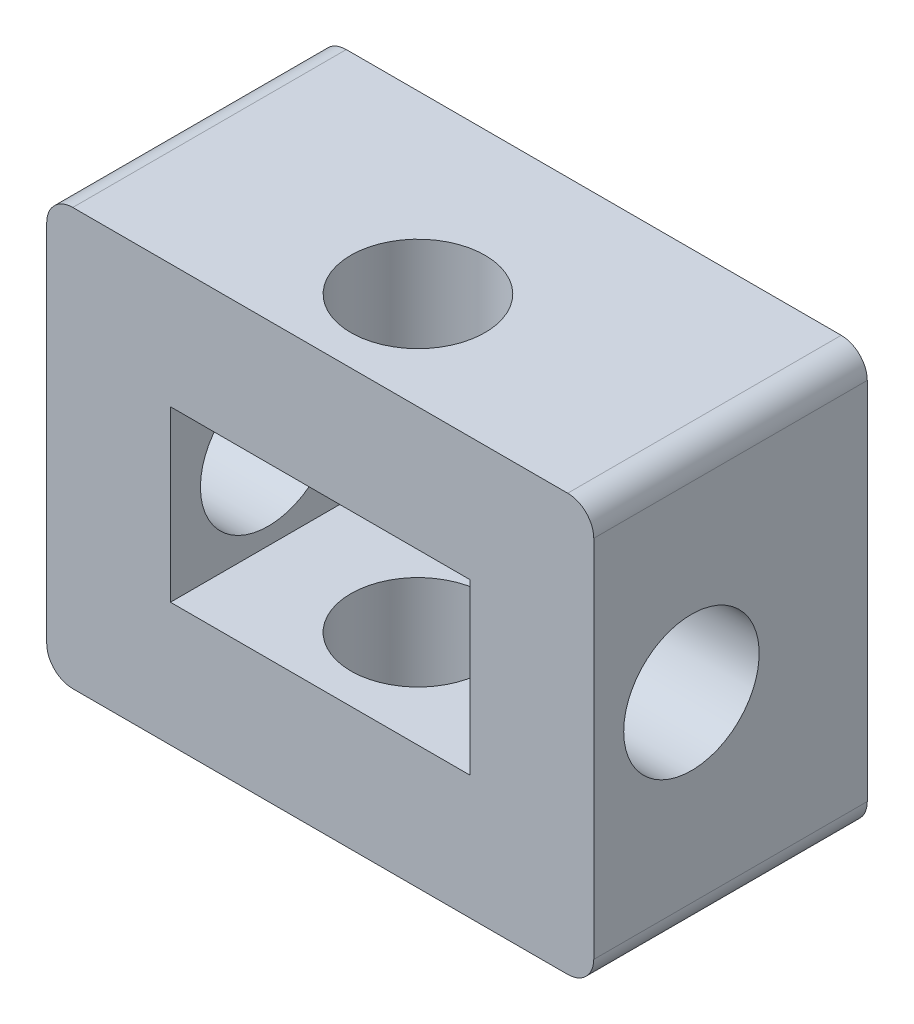
ISO-10303-21;
HEADER;
FILE_DESCRIPTION(('STEP AP214'),'2;1');
FILE_NAME('part.step','',(''),(''),'','','');
FILE_SCHEMA(('AUTOMOTIVE_DESIGN { 1 0 10303 214 1 1 1 1 }'));
ENDSEC;
DATA;
#1=APPLICATION_CONTEXT('core data for automotive mechanical design processes');
#2=APPLICATION_PROTOCOL_DEFINITION('international standard','automotive_design',2000,#1);
#3=PRODUCT_CONTEXT('',#1,'mechanical');
#4=PRODUCT('Part','Part','',(#3));
#5=PRODUCT_RELATED_PRODUCT_CATEGORY('part','',(#4));
#6=PRODUCT_DEFINITION_FORMATION('','',#4);
#7=PRODUCT_DEFINITION_CONTEXT('part definition',#1,'design');
#8=PRODUCT_DEFINITION('design','',#6,#7);
#9=PRODUCT_DEFINITION_SHAPE('','',#8);
#10=(LENGTH_UNIT() NAMED_UNIT(*) SI_UNIT(.MILLI.,.METRE.));
#11=(NAMED_UNIT(*) PLANE_ANGLE_UNIT() SI_UNIT($,.RADIAN.));
#12=(NAMED_UNIT(*) SI_UNIT($,.STERADIAN.) SOLID_ANGLE_UNIT());
#13=UNCERTAINTY_MEASURE_WITH_UNIT(LENGTH_MEASURE(1.E-05),#10,'distance_accuracy_value','');
#14=(GEOMETRIC_REPRESENTATION_CONTEXT(3) GLOBAL_UNCERTAINTY_ASSIGNED_CONTEXT((#13)) GLOBAL_UNIT_ASSIGNED_CONTEXT((#10,
#11,#12)) REPRESENTATION_CONTEXT('',''));
#15=CARTESIAN_POINT('',(0.,0.,0.));
#16=DIRECTION('',(0.,0.,1.));
#17=DIRECTION('',(1.,0.,0.));
#18=AXIS2_PLACEMENT_3D('',#15,#16,#17);
#19=CARTESIAN_POINT('',(-21.,-16.,21.));
#20=DIRECTION('',(1.,0.,0.));
#21=DIRECTION('',(0.,0.,-1.));
#22=AXIS2_PLACEMENT_3D('',#19,#20,#21);
#23=PLANE('',#22);
#24=CARTESIAN_POINT('',(-21.,0.,13.5));
#25=DIRECTION('',(-1.,0.,0.));
#26=DIRECTION('',(0.,0.,1.));
#27=AXIS2_PLACEMENT_3D('',#24,#25,#26);
#28=CIRCLE('',#27,5.2);
#29=CARTESIAN_POINT('',(-21.,0.,18.7));
#30=VERTEX_POINT('',#29);
#31=EDGE_CURVE('E533',#30,#30,#28,.T.);
#32=ORIENTED_EDGE('',*,*,#31,.F.);
#33=EDGE_LOOP('',(#32));
#34=FACE_BOUND('',#33,.T.);
#35=DIRECTION('',(0.,-1.,0.));
#36=VECTOR('',#35,1.);
#37=CARTESIAN_POINT('',(-21.,-16.,0.));
#38=LINE('',#37,#36);
#39=CARTESIAN_POINT('',(-21.,14.,0.));
#40=VERTEX_POINT('',#39);
#41=CARTESIAN_POINT('',(-21.,-14.,0.));
#42=VERTEX_POINT('',#41);
#43=EDGE_CURVE('E186',#40,#42,#38,.T.);
#44=ORIENTED_EDGE('',*,*,#43,.T.);
#45=DIRECTION('',(0.,0.,-1.));
#46=VECTOR('',#45,1.);
#47=CARTESIAN_POINT('',(-21.,-14.,21.));
#48=LINE('',#47,#46);
#49=CARTESIAN_POINT('',(-21.,-14.,21.));
#50=VERTEX_POINT('',#49);
#51=EDGE_CURVE('E273',#42,#50,#48,.F.);
#52=ORIENTED_EDGE('',*,*,#51,.T.);
#53=DIRECTION('',(0.,-1.,0.));
#54=VECTOR('',#53,1.);
#55=CARTESIAN_POINT('',(-21.,-16.,21.));
#56=LINE('',#55,#54);
#57=CARTESIAN_POINT('',(-21.,14.,21.));
#58=VERTEX_POINT('',#57);
#59=EDGE_CURVE('E192',#58,#50,#56,.T.);
#60=ORIENTED_EDGE('',*,*,#59,.F.);
#61=DIRECTION('',(0.,0.,-1.));
#62=VECTOR('',#61,1.);
#63=CARTESIAN_POINT('',(-21.,14.,21.));
#64=LINE('',#63,#62);
#65=EDGE_CURVE('E269',#58,#40,#64,.T.);
#66=ORIENTED_EDGE('',*,*,#65,.T.);
#67=EDGE_LOOP('',(#44,#52,#60,#66));
#68=FACE_BOUND('',#67,.T.);
#69=ADVANCED_FACE('F43',(#34,#68),#23,.F.);
#70=CARTESIAN_POINT('',(21.,-16.,21.));
#71=DIRECTION('',(0.,1.,0.));
#72=DIRECTION('',(-1.,0.,0.));
#73=AXIS2_PLACEMENT_3D('',#70,#71,#72);
#74=PLANE('',#73);
#75=CARTESIAN_POINT('',(0.,-16.,13.5));
#76=DIRECTION('',(0.,1.,0.));
#77=DIRECTION('',(-1.,0.,0.));
#78=AXIS2_PLACEMENT_3D('',#75,#76,#77);
#79=CIRCLE('',#78,5.15);
#80=CARTESIAN_POINT('',(-5.15,-16.,13.5));
#81=VERTEX_POINT('',#80);
#82=EDGE_CURVE('E232',#81,#81,#79,.T.);
#83=ORIENTED_EDGE('',*,*,#82,.T.);
#84=EDGE_LOOP('',(#83));
#85=FACE_BOUND('',#84,.T.);
#86=DIRECTION('',(1.,0.,0.));
#87=VECTOR('',#86,1.);
#88=CARTESIAN_POINT('',(21.,-16.,0.));
#89=LINE('',#88,#87);
#90=CARTESIAN_POINT('',(-19.,-16.,0.));
#91=VERTEX_POINT('',#90);
#92=CARTESIAN_POINT('',(19.,-16.,0.));
#93=VERTEX_POINT('',#92);
#94=EDGE_CURVE('E211',#91,#93,#89,.T.);
#95=ORIENTED_EDGE('',*,*,#94,.T.);
#96=DIRECTION('',(0.,0.,-1.));
#97=VECTOR('',#96,1.);
#98=CARTESIAN_POINT('',(19.,-16.,21.));
#99=LINE('',#98,#97);
#100=CARTESIAN_POINT('',(19.,-16.,21.));
#101=VERTEX_POINT('',#100);
#102=EDGE_CURVE('E255',#93,#101,#99,.F.);
#103=ORIENTED_EDGE('',*,*,#102,.T.);
#104=DIRECTION('',(1.,0.,0.));
#105=VECTOR('',#104,1.);
#106=CARTESIAN_POINT('',(21.,-16.,21.));
#107=LINE('',#106,#105);
#108=CARTESIAN_POINT('',(-19.,-16.,21.));
#109=VERTEX_POINT('',#108);
#110=EDGE_CURVE('E196',#109,#101,#107,.T.);
#111=ORIENTED_EDGE('',*,*,#110,.F.);
#112=DIRECTION('',(0.,0.,-1.));
#113=VECTOR('',#112,1.);
#114=CARTESIAN_POINT('',(-19.,-16.,21.));
#115=LINE('',#114,#113);
#116=EDGE_CURVE('E251',#109,#91,#115,.T.);
#117=ORIENTED_EDGE('',*,*,#116,.T.);
#118=EDGE_LOOP('',(#95,#103,#111,#117));
#119=FACE_BOUND('',#118,.T.);
#120=ADVANCED_FACE('F300',(#85,#119),#74,.F.);
#121=CARTESIAN_POINT('',(21.,-16.,21.));
#122=DIRECTION('',(-1.,0.,0.));
#123=DIRECTION('',(0.,0.,1.));
#124=AXIS2_PLACEMENT_3D('',#121,#122,#123);
#125=PLANE('',#124);
#126=CARTESIAN_POINT('',(21.,0.,13.5));
#127=DIRECTION('',(-1.,0.,0.));
#128=DIRECTION('',(0.,0.,1.));
#129=AXIS2_PLACEMENT_3D('',#126,#127,#128);
#130=CIRCLE('',#129,5.2);
#131=CARTESIAN_POINT('',(21.,0.,18.7));
#132=VERTEX_POINT('',#131);
#133=EDGE_CURVE('E226',#132,#132,#130,.T.);
#134=ORIENTED_EDGE('',*,*,#133,.T.);
#135=EDGE_LOOP('',(#134));
#136=FACE_BOUND('',#135,.T.);
#137=DIRECTION('',(0.,1.,0.));
#138=VECTOR('',#137,1.);
#139=CARTESIAN_POINT('',(21.,-16.,21.));
#140=LINE('',#139,#138);
#141=CARTESIAN_POINT('',(21.,-14.,21.));
#142=VERTEX_POINT('',#141);
#143=CARTESIAN_POINT('',(21.,14.,21.));
#144=VERTEX_POINT('',#143);
#145=EDGE_CURVE('E201',#142,#144,#140,.T.);
#146=ORIENTED_EDGE('',*,*,#145,.F.);
#147=DIRECTION('',(0.,0.,-1.));
#148=VECTOR('',#147,1.);
#149=CARTESIAN_POINT('',(21.,-14.,21.));
#150=LINE('',#149,#148);
#151=CARTESIAN_POINT('',(21.,-14.,0.));
#152=VERTEX_POINT('',#151);
#153=EDGE_CURVE('E235',#142,#152,#150,.T.);
#154=ORIENTED_EDGE('',*,*,#153,.T.);
#155=DIRECTION('',(0.,1.,0.));
#156=VECTOR('',#155,1.);
#157=CARTESIAN_POINT('',(21.,-16.,0.));
#158=LINE('',#157,#156);
#159=CARTESIAN_POINT('',(21.,14.,0.));
#160=VERTEX_POINT('',#159);
#161=EDGE_CURVE('E215',#152,#160,#158,.T.);
#162=ORIENTED_EDGE('',*,*,#161,.T.);
#163=DIRECTION('',(0.,0.,-1.));
#164=VECTOR('',#163,1.);
#165=CARTESIAN_POINT('',(21.,14.,21.));
#166=LINE('',#165,#164);
#167=EDGE_CURVE('E207',#160,#144,#166,.F.);
#168=ORIENTED_EDGE('',*,*,#167,.T.);
#169=EDGE_LOOP('',(#146,#154,#162,#168));
#170=FACE_BOUND('',#169,.T.);
#171=ADVANCED_FACE('F308',(#136,#170),#125,.F.);
#172=CARTESIAN_POINT('',(21.,16.,21.));
#173=DIRECTION('',(0.,-1.,0.));
#174=DIRECTION('',(0.,0.,-1.));
#175=AXIS2_PLACEMENT_3D('',#172,#173,#174);
#176=PLANE('',#175);
#177=CARTESIAN_POINT('',(0.,16.,13.5));
#178=DIRECTION('',(0.,1.,0.));
#179=DIRECTION('',(-1.,0.,0.));
#180=AXIS2_PLACEMENT_3D('',#177,#178,#179);
#181=CIRCLE('',#180,5.15);
#182=CARTESIAN_POINT('',(-5.15000000000001,16.,13.5));
#183=VERTEX_POINT('',#182);
#184=EDGE_CURVE('E557',#183,#183,#181,.T.);
#185=ORIENTED_EDGE('',*,*,#184,.F.);
#186=EDGE_LOOP('',(#185));
#187=FACE_BOUND('',#186,.T.);
#188=DIRECTION('',(-1.,0.,0.));
#189=VECTOR('',#188,1.);
#190=CARTESIAN_POINT('',(21.,16.,0.));
#191=LINE('',#190,#189);
#192=CARTESIAN_POINT('',(19.,16.,0.));
#193=VERTEX_POINT('',#192);
#194=CARTESIAN_POINT('',(-19.,16.,0.));
#195=VERTEX_POINT('',#194);
#196=EDGE_CURVE('E197',#193,#195,#191,.T.);
#197=ORIENTED_EDGE('',*,*,#196,.T.);
#198=DIRECTION('',(0.,0.,-1.));
#199=VECTOR('',#198,1.);
#200=CARTESIAN_POINT('',(-19.,16.,21.));
#201=LINE('',#200,#199);
#202=CARTESIAN_POINT('',(-19.,16.,21.));
#203=VERTEX_POINT('',#202);
#204=EDGE_CURVE('E11',#195,#203,#201,.F.);
#205=ORIENTED_EDGE('',*,*,#204,.T.);
#206=DIRECTION('',(-1.,0.,0.));
#207=VECTOR('',#206,1.);
#208=CARTESIAN_POINT('',(21.,16.,21.));
#209=LINE('',#208,#207);
#210=CARTESIAN_POINT('',(19.,16.,21.));
#211=VERTEX_POINT('',#210);
#212=EDGE_CURVE('E204',#211,#203,#209,.T.);
#213=ORIENTED_EDGE('',*,*,#212,.F.);
#214=DIRECTION('',(0.,0.,-1.));
#215=VECTOR('',#214,1.);
#216=CARTESIAN_POINT('',(19.,16.,21.));
#217=LINE('',#216,#215);
#218=EDGE_CURVE('E52',#211,#193,#217,.T.);
#219=ORIENTED_EDGE('',*,*,#218,.T.);
#220=EDGE_LOOP('',(#197,#205,#213,#219));
#221=FACE_BOUND('',#220,.T.);
#222=ADVANCED_FACE('F279',(#187,#221),#176,.F.);
#223=CARTESIAN_POINT('',(0.,0.,21.));
#224=DIRECTION('',(0.,0.,1.));
#225=DIRECTION('',(1.,0.,0.));
#226=AXIS2_PLACEMENT_3D('',#223,#224,#225);
#227=PLANE('',#226);
#228=DIRECTION('',(0.,-1.,0.));
#229=VECTOR('',#228,1.);
#230=CARTESIAN_POINT('',(-11.5,-6.5,21.));
#231=LINE('',#230,#229);
#232=CARTESIAN_POINT('',(-11.5,6.5,21.));
#233=VERTEX_POINT('',#232);
#234=CARTESIAN_POINT('',(-11.5,-6.5,21.));
#235=VERTEX_POINT('',#234);
#236=EDGE_CURVE('E140',#233,#235,#231,.T.);
#237=ORIENTED_EDGE('',*,*,#236,.F.);
#238=DIRECTION('',(-1.,0.,0.));
#239=VECTOR('',#238,1.);
#240=CARTESIAN_POINT('',(11.5,6.5,21.));
#241=LINE('',#240,#239);
#242=CARTESIAN_POINT('',(11.5,6.5,21.));
#243=VERTEX_POINT('',#242);
#244=EDGE_CURVE('E160',#243,#233,#241,.T.);
#245=ORIENTED_EDGE('',*,*,#244,.F.);
#246=DIRECTION('',(0.,1.,0.));
#247=VECTOR('',#246,1.);
#248=CARTESIAN_POINT('',(11.5,-6.5,21.));
#249=LINE('',#248,#247);
#250=CARTESIAN_POINT('',(11.5,-6.5,21.));
#251=VERTEX_POINT('',#250);
#252=EDGE_CURVE('E164',#251,#243,#249,.T.);
#253=ORIENTED_EDGE('',*,*,#252,.F.);
#254=DIRECTION('',(1.,0.,0.));
#255=VECTOR('',#254,1.);
#256=CARTESIAN_POINT('',(11.5,-6.5,21.));
#257=LINE('',#256,#255);
#258=EDGE_CURVE('E176',#235,#251,#257,.T.);
#259=ORIENTED_EDGE('',*,*,#258,.F.);
#260=EDGE_LOOP('',(#237,#245,#253,#259));
#261=FACE_BOUND('',#260,.T.);
#262=ORIENTED_EDGE('',*,*,#110,.T.);
#263=CARTESIAN_POINT('',(19.,-14.,21.));
#264=DIRECTION('',(0.,0.,1.));
#265=DIRECTION('',(1.,0.,0.));
#266=AXIS2_PLACEMENT_3D('',#263,#264,#265);
#267=CIRCLE('',#266,2.);
#268=EDGE_CURVE('E266',#101,#142,#267,.T.);
#269=ORIENTED_EDGE('',*,*,#268,.T.);
#270=ORIENTED_EDGE('',*,*,#145,.T.);
#271=CARTESIAN_POINT('',(19.,14.,21.));
#272=DIRECTION('',(0.,0.,1.));
#273=DIRECTION('',(1.,0.,0.));
#274=AXIS2_PLACEMENT_3D('',#271,#272,#273);
#275=CIRCLE('',#274,2.);
#276=EDGE_CURVE('E64',#144,#211,#275,.T.);
#277=ORIENTED_EDGE('',*,*,#276,.T.);
#278=ORIENTED_EDGE('',*,*,#212,.T.);
#279=CARTESIAN_POINT('',(-19.,14.,21.));
#280=DIRECTION('',(0.,0.,1.));
#281=DIRECTION('',(1.,0.,0.));
#282=AXIS2_PLACEMENT_3D('',#279,#280,#281);
#283=CIRCLE('',#282,2.);
#284=EDGE_CURVE('E260',#203,#58,#283,.T.);
#285=ORIENTED_EDGE('',*,*,#284,.T.);
#286=ORIENTED_EDGE('',*,*,#59,.T.);
#287=CARTESIAN_POINT('',(-19.,-14.,21.));
#288=DIRECTION('',(0.,0.,1.));
#289=DIRECTION('',(1.,0.,0.));
#290=AXIS2_PLACEMENT_3D('',#287,#288,#289);
#291=CIRCLE('',#290,2.);
#292=EDGE_CURVE('E263',#50,#109,#291,.T.);
#293=ORIENTED_EDGE('',*,*,#292,.T.);
#294=EDGE_LOOP('',(#262,#269,#270,#277,#278,#285,#286,#293));
#295=FACE_BOUND('',#294,.T.);
#296=ADVANCED_FACE('F293',(#261,#295),#227,.T.);
#297=CARTESIAN_POINT('',(0.,0.,0.));
#298=DIRECTION('',(0.,0.,1.));
#299=DIRECTION('',(1.,0.,0.));
#300=AXIS2_PLACEMENT_3D('',#297,#298,#299);
#301=PLANE('',#300);
#302=CARTESIAN_POINT('',(5.51092459471647,0.660459352857856,0.));
#303=DIRECTION('',(0.,0.,1.));
#304=DIRECTION('',(1.,0.,0.));
#305=AXIS2_PLACEMENT_3D('',#302,#303,#304);
#306=CIRCLE('',#305,4.5);
#307=CARTESIAN_POINT('',(10.0109245947165,0.660459352857856,0.));
#308=VERTEX_POINT('',#307);
#309=EDGE_CURVE('E177',#308,#308,#306,.T.);
#310=ORIENTED_EDGE('',*,*,#309,.T.);
#311=EDGE_LOOP('',(#310));
#312=FACE_BOUND('',#311,.T.);
#313=ORIENTED_EDGE('',*,*,#161,.F.);
#314=CARTESIAN_POINT('',(19.,-14.,0.));
#315=DIRECTION('',(0.,0.,1.));
#316=DIRECTION('',(1.,0.,0.));
#317=AXIS2_PLACEMENT_3D('',#314,#315,#316);
#318=CIRCLE('',#317,2.);
#319=EDGE_CURVE('E248',#152,#93,#318,.F.);
#320=ORIENTED_EDGE('',*,*,#319,.T.);
#321=ORIENTED_EDGE('',*,*,#94,.F.);
#322=CARTESIAN_POINT('',(-19.,-14.,0.));
#323=DIRECTION('',(0.,0.,1.));
#324=DIRECTION('',(1.,0.,0.));
#325=AXIS2_PLACEMENT_3D('',#322,#323,#324);
#326=CIRCLE('',#325,2.);
#327=EDGE_CURVE('E245',#91,#42,#326,.F.);
#328=ORIENTED_EDGE('',*,*,#327,.T.);
#329=ORIENTED_EDGE('',*,*,#43,.F.);
#330=CARTESIAN_POINT('',(-19.,14.,0.));
#331=DIRECTION('',(0.,0.,1.));
#332=DIRECTION('',(1.,0.,0.));
#333=AXIS2_PLACEMENT_3D('',#330,#331,#332);
#334=CIRCLE('',#333,2.);
#335=EDGE_CURVE('E242',#40,#195,#334,.F.);
#336=ORIENTED_EDGE('',*,*,#335,.T.);
#337=ORIENTED_EDGE('',*,*,#196,.F.);
#338=CARTESIAN_POINT('',(19.,14.,0.));
#339=DIRECTION('',(0.,0.,1.));
#340=DIRECTION('',(1.,0.,0.));
#341=AXIS2_PLACEMENT_3D('',#338,#339,#340);
#342=CIRCLE('',#341,2.);
#343=EDGE_CURVE('E239',#193,#160,#342,.F.);
#344=ORIENTED_EDGE('',*,*,#343,.T.);
#345=EDGE_LOOP('',(#313,#320,#321,#328,#329,#336,#337,#344));
#346=FACE_BOUND('',#345,.T.);
#347=ADVANCED_FACE('F283',(#312,#346),#301,.F.);
#348=CARTESIAN_POINT('',(-11.5,-6.5,6.));
#349=DIRECTION('',(-1.,0.,0.));
#350=DIRECTION('',(0.,0.,1.));
#351=AXIS2_PLACEMENT_3D('',#348,#349,#350);
#352=PLANE('',#351);
#353=CARTESIAN_POINT('',(-11.5,0.,13.5));
#354=DIRECTION('',(-1.,0.,0.));
#355=DIRECTION('',(0.,0.,1.));
#356=AXIS2_PLACEMENT_3D('',#353,#354,#355);
#357=CIRCLE('',#356,5.2);
#358=CARTESIAN_POINT('',(-11.5,0.,18.7));
#359=VERTEX_POINT('',#358);
#360=EDGE_CURVE('E225',#359,#359,#357,.T.);
#361=ORIENTED_EDGE('',*,*,#360,.T.);
#362=EDGE_LOOP('',(#361));
#363=FACE_BOUND('',#362,.T.);
#364=ORIENTED_EDGE('',*,*,#236,.T.);
#365=DIRECTION('',(0.,0.,1.));
#366=VECTOR('',#365,1.);
#367=CARTESIAN_POINT('',(-11.5,-6.5,6.));
#368=LINE('',#367,#366);
#369=CARTESIAN_POINT('',(-11.5,-6.5,6.));
#370=VERTEX_POINT('',#369);
#371=EDGE_CURVE('E133',#370,#235,#368,.T.);
#372=ORIENTED_EDGE('',*,*,#371,.F.);
#373=DIRECTION('',(0.,-1.,0.));
#374=VECTOR('',#373,1.);
#375=CARTESIAN_POINT('',(-11.5,-6.5,6.));
#376=LINE('',#375,#374);
#377=CARTESIAN_POINT('',(-11.5,6.5,6.));
#378=VERTEX_POINT('',#377);
#379=EDGE_CURVE('E137',#378,#370,#376,.T.);
#380=ORIENTED_EDGE('',*,*,#379,.F.);
#381=DIRECTION('',(0.,0.,1.));
#382=VECTOR('',#381,1.);
#383=CARTESIAN_POINT('',(-11.5,6.5,6.));
#384=LINE('',#383,#382);
#385=EDGE_CURVE('E183',#378,#233,#384,.T.);
#386=ORIENTED_EDGE('',*,*,#385,.T.);
#387=EDGE_LOOP('',(#364,#372,#380,#386));
#388=FACE_BOUND('',#387,.T.);
#389=ADVANCED_FACE('F135',(#363,#388),#352,.F.);
#390=CARTESIAN_POINT('',(11.5,6.5,6.));
#391=DIRECTION('',(0.,1.,0.));
#392=DIRECTION('',(-1.,0.,0.));
#393=AXIS2_PLACEMENT_3D('',#390,#391,#392);
#394=PLANE('',#393);
#395=CARTESIAN_POINT('',(0.,6.5,13.5));
#396=DIRECTION('',(0.,1.,0.));
#397=DIRECTION('',(-1.,0.,0.));
#398=AXIS2_PLACEMENT_3D('',#395,#396,#397);
#399=CIRCLE('',#398,5.15);
#400=CARTESIAN_POINT('',(-5.15000000000001,6.5,13.5));
#401=VERTEX_POINT('',#400);
#402=EDGE_CURVE('E231',#401,#401,#399,.T.);
#403=ORIENTED_EDGE('',*,*,#402,.T.);
#404=EDGE_LOOP('',(#403));
#405=FACE_BOUND('',#404,.T.);
#406=ORIENTED_EDGE('',*,*,#244,.T.);
#407=ORIENTED_EDGE('',*,*,#385,.F.);
#408=DIRECTION('',(-1.,0.,0.));
#409=VECTOR('',#408,1.);
#410=CARTESIAN_POINT('',(11.5,6.5,6.));
#411=LINE('',#410,#409);
#412=CARTESIAN_POINT('',(11.5,6.5,6.));
#413=VERTEX_POINT('',#412);
#414=EDGE_CURVE('E146',#413,#378,#411,.T.);
#415=ORIENTED_EDGE('',*,*,#414,.F.);
#416=DIRECTION('',(0.,0.,1.));
#417=VECTOR('',#416,1.);
#418=CARTESIAN_POINT('',(11.5,6.5,6.));
#419=LINE('',#418,#417);
#420=EDGE_CURVE('E187',#413,#243,#419,.T.);
#421=ORIENTED_EDGE('',*,*,#420,.T.);
#422=EDGE_LOOP('',(#406,#407,#415,#421));
#423=FACE_BOUND('',#422,.T.);
#424=ADVANCED_FACE('F429',(#405,#423),#394,.F.);
#425=CARTESIAN_POINT('',(11.5,-6.5,6.));
#426=DIRECTION('',(1.,0.,0.));
#427=DIRECTION('',(0.,0.,-1.));
#428=AXIS2_PLACEMENT_3D('',#425,#426,#427);
#429=PLANE('',#428);
#430=CARTESIAN_POINT('',(11.5,0.,13.5));
#431=DIRECTION('',(1.,0.,0.));
#432=DIRECTION('',(0.,0.,-1.));
#433=AXIS2_PLACEMENT_3D('',#430,#431,#432);
#434=CIRCLE('',#433,5.2);
#435=CARTESIAN_POINT('',(11.5,0.,8.3));
#436=VERTEX_POINT('',#435);
#437=EDGE_CURVE('E221',#436,#436,#434,.T.);
#438=ORIENTED_EDGE('',*,*,#437,.T.);
#439=EDGE_LOOP('',(#438));
#440=FACE_BOUND('',#439,.T.);
#441=ORIENTED_EDGE('',*,*,#252,.T.);
#442=ORIENTED_EDGE('',*,*,#420,.F.);
#443=DIRECTION('',(0.,1.,0.));
#444=VECTOR('',#443,1.);
#445=CARTESIAN_POINT('',(11.5,-6.5,6.));
#446=LINE('',#445,#444);
#447=CARTESIAN_POINT('',(11.5,-6.5,6.));
#448=VERTEX_POINT('',#447);
#449=EDGE_CURVE('E155',#448,#413,#446,.T.);
#450=ORIENTED_EDGE('',*,*,#449,.F.);
#451=DIRECTION('',(0.,0.,1.));
#452=VECTOR('',#451,1.);
#453=CARTESIAN_POINT('',(11.5,-6.5,6.));
#454=LINE('',#453,#452);
#455=EDGE_CURVE('E145',#448,#251,#454,.T.);
#456=ORIENTED_EDGE('',*,*,#455,.T.);
#457=EDGE_LOOP('',(#441,#442,#450,#456));
#458=FACE_BOUND('',#457,.T.);
#459=ADVANCED_FACE('F419',(#440,#458),#429,.F.);
#460=CARTESIAN_POINT('',(11.5,-6.5,6.));
#461=DIRECTION('',(0.,-1.,0.));
#462=DIRECTION('',(1.,0.,0.));
#463=AXIS2_PLACEMENT_3D('',#460,#461,#462);
#464=PLANE('',#463);
#465=CARTESIAN_POINT('',(0.,-6.5,13.5));
#466=DIRECTION('',(0.,-1.,0.));
#467=DIRECTION('',(1.,0.,0.));
#468=AXIS2_PLACEMENT_3D('',#465,#466,#467);
#469=CIRCLE('',#468,5.15);
#470=CARTESIAN_POINT('',(5.15,-6.5,13.5));
#471=VERTEX_POINT('',#470);
#472=EDGE_CURVE('E227',#471,#471,#469,.T.);
#473=ORIENTED_EDGE('',*,*,#472,.T.);
#474=EDGE_LOOP('',(#473));
#475=FACE_BOUND('',#474,.T.);
#476=ORIENTED_EDGE('',*,*,#258,.T.);
#477=ORIENTED_EDGE('',*,*,#455,.F.);
#478=DIRECTION('',(1.,0.,0.));
#479=VECTOR('',#478,1.);
#480=CARTESIAN_POINT('',(11.5,-6.5,6.));
#481=LINE('',#480,#479);
#482=EDGE_CURVE('E149',#370,#448,#481,.T.);
#483=ORIENTED_EDGE('',*,*,#482,.F.);
#484=ORIENTED_EDGE('',*,*,#371,.T.);
#485=EDGE_LOOP('',(#476,#477,#483,#484));
#486=FACE_BOUND('',#485,.T.);
#487=ADVANCED_FACE('F150',(#475,#486),#464,.F.);
#488=CARTESIAN_POINT('',(0.,0.,6.));
#489=DIRECTION('',(0.,0.,1.));
#490=DIRECTION('',(1.,0.,0.));
#491=AXIS2_PLACEMENT_3D('',#488,#489,#490);
#492=PLANE('',#491);
#493=CARTESIAN_POINT('',(5.51092459471647,0.660459352857856,6.));
#494=DIRECTION('',(0.,0.,1.));
#495=DIRECTION('',(1.,0.,0.));
#496=AXIS2_PLACEMENT_3D('',#493,#494,#495);
#497=CIRCLE('',#496,4.5);
#498=CARTESIAN_POINT('',(10.0109245947165,0.660459352857856,6.));
#499=VERTEX_POINT('',#498);
#500=EDGE_CURVE('E167',#499,#499,#497,.T.);
#501=ORIENTED_EDGE('',*,*,#500,.F.);
#502=EDGE_LOOP('',(#501));
#503=FACE_BOUND('',#502,.T.);
#504=ORIENTED_EDGE('',*,*,#379,.T.);
#505=ORIENTED_EDGE('',*,*,#482,.T.);
#506=ORIENTED_EDGE('',*,*,#449,.T.);
#507=ORIENTED_EDGE('',*,*,#414,.T.);
#508=EDGE_LOOP('',(#504,#505,#506,#507));
#509=FACE_BOUND('',#508,.T.);
#510=ADVANCED_FACE('F157',(#503,#509),#492,.T.);
#511=CARTESIAN_POINT('',(5.51092459471647,0.660459352857856,0.));
#512=DIRECTION('',(0.,0.,1.));
#513=DIRECTION('',(1.,0.,0.));
#514=AXIS2_PLACEMENT_3D('',#511,#512,#513);
#515=CYLINDRICAL_SURFACE('',#514,4.5);
#516=ORIENTED_EDGE('',*,*,#309,.F.);
#517=EDGE_LOOP('',(#516));
#518=FACE_BOUND('',#517,.T.);
#519=ORIENTED_EDGE('',*,*,#500,.T.);
#520=EDGE_LOOP('',(#519));
#521=FACE_BOUND('',#520,.T.);
#522=ADVANCED_FACE('F392',(#518,#521),#515,.F.);
#523=CARTESIAN_POINT('',(21.,0.,13.5));
#524=DIRECTION('',(-1.,0.,0.));
#525=DIRECTION('',(0.,0.,1.));
#526=AXIS2_PLACEMENT_3D('',#523,#524,#525);
#527=CYLINDRICAL_SURFACE('',#526,5.2);
#528=ORIENTED_EDGE('',*,*,#133,.F.);
#529=EDGE_LOOP('',(#528));
#530=FACE_BOUND('',#529,.T.);
#531=ORIENTED_EDGE('',*,*,#437,.F.);
#532=EDGE_LOOP('',(#531));
#533=FACE_BOUND('',#532,.T.);
#534=ADVANCED_FACE('F382',(#530,#533),#527,.F.);
#535=ORIENTED_EDGE('',*,*,#31,.T.);
#536=EDGE_LOOP('',(#535));
#537=FACE_BOUND('',#536,.T.);
#538=ORIENTED_EDGE('',*,*,#360,.F.);
#539=EDGE_LOOP('',(#538));
#540=FACE_BOUND('',#539,.T.);
#541=ADVANCED_FACE('F373',(#537,#540),#527,.F.);
#542=CARTESIAN_POINT('',(0.,-16.,13.5));
#543=DIRECTION('',(0.,1.,0.));
#544=DIRECTION('',(-1.,0.,0.));
#545=AXIS2_PLACEMENT_3D('',#542,#543,#544);
#546=CYLINDRICAL_SURFACE('',#545,5.15);
#547=ORIENTED_EDGE('',*,*,#82,.F.);
#548=EDGE_LOOP('',(#547));
#549=FACE_BOUND('',#548,.T.);
#550=ORIENTED_EDGE('',*,*,#472,.F.);
#551=EDGE_LOOP('',(#550));
#552=FACE_BOUND('',#551,.T.);
#553=ADVANCED_FACE('F363',(#549,#552),#546,.F.);
#554=ORIENTED_EDGE('',*,*,#184,.T.);
#555=EDGE_LOOP('',(#554));
#556=FACE_BOUND('',#555,.T.);
#557=ORIENTED_EDGE('',*,*,#402,.F.);
#558=EDGE_LOOP('',(#557));
#559=FACE_BOUND('',#558,.T.);
#560=ADVANCED_FACE('F327',(#556,#559),#546,.F.);
#561=CARTESIAN_POINT('',(19.,-14.,21.));
#562=DIRECTION('',(0.,0.,-1.));
#563=DIRECTION('',(-1.,0.,0.));
#564=AXIS2_PLACEMENT_3D('',#561,#562,#563);
#565=CYLINDRICAL_SURFACE('',#564,2.);
#566=ORIENTED_EDGE('',*,*,#268,.F.);
#567=ORIENTED_EDGE('',*,*,#102,.F.);
#568=ORIENTED_EDGE('',*,*,#319,.F.);
#569=ORIENTED_EDGE('',*,*,#153,.F.);
#570=EDGE_LOOP('',(#566,#567,#568,#569));
#571=FACE_BOUND('',#570,.T.);
#572=ADVANCED_FACE('F305',(#571),#565,.T.);
#573=CARTESIAN_POINT('',(-19.,-14.,21.));
#574=DIRECTION('',(0.,0.,-1.));
#575=DIRECTION('',(-1.,0.,0.));
#576=AXIS2_PLACEMENT_3D('',#573,#574,#575);
#577=CYLINDRICAL_SURFACE('',#576,2.);
#578=ORIENTED_EDGE('',*,*,#292,.F.);
#579=ORIENTED_EDGE('',*,*,#51,.F.);
#580=ORIENTED_EDGE('',*,*,#327,.F.);
#581=ORIENTED_EDGE('',*,*,#116,.F.);
#582=EDGE_LOOP('',(#578,#579,#580,#581));
#583=FACE_BOUND('',#582,.T.);
#584=ADVANCED_FACE('F297',(#583),#577,.T.);
#585=CARTESIAN_POINT('',(-19.,14.,21.));
#586=DIRECTION('',(0.,0.,-1.));
#587=DIRECTION('',(-1.,0.,0.));
#588=AXIS2_PLACEMENT_3D('',#585,#586,#587);
#589=CYLINDRICAL_SURFACE('',#588,2.);
#590=ORIENTED_EDGE('',*,*,#284,.F.);
#591=ORIENTED_EDGE('',*,*,#204,.F.);
#592=ORIENTED_EDGE('',*,*,#335,.F.);
#593=ORIENTED_EDGE('',*,*,#65,.F.);
#594=EDGE_LOOP('',(#590,#591,#592,#593));
#595=FACE_BOUND('',#594,.T.);
#596=ADVANCED_FACE('F288',(#595),#589,.T.);
#597=CARTESIAN_POINT('',(19.,14.,21.));
#598=DIRECTION('',(0.,0.,-1.));
#599=DIRECTION('',(-1.,0.,0.));
#600=AXIS2_PLACEMENT_3D('',#597,#598,#599);
#601=CYLINDRICAL_SURFACE('',#600,2.);
#602=ORIENTED_EDGE('',*,*,#276,.F.);
#603=ORIENTED_EDGE('',*,*,#167,.F.);
#604=ORIENTED_EDGE('',*,*,#343,.F.);
#605=ORIENTED_EDGE('',*,*,#218,.F.);
#606=EDGE_LOOP('',(#602,#603,#604,#605));
#607=FACE_BOUND('',#606,.T.);
#608=ADVANCED_FACE('F45',(#607),#601,.T.);
#609=CLOSED_SHELL('',(#69,#120,#171,#222,#296,#347,#389,#424,#459,#487,#510,#522,#534,#541,#553,
#560,#572,#584,#596,#608));
#610=MANIFOLD_SOLID_BREP('B2',#609);
#611=ADVANCED_BREP_SHAPE_REPRESENTATION('',(#18,#610),#14);
#612=SHAPE_DEFINITION_REPRESENTATION(#9,#611);
ENDSEC;
END-ISO-10303-21;
